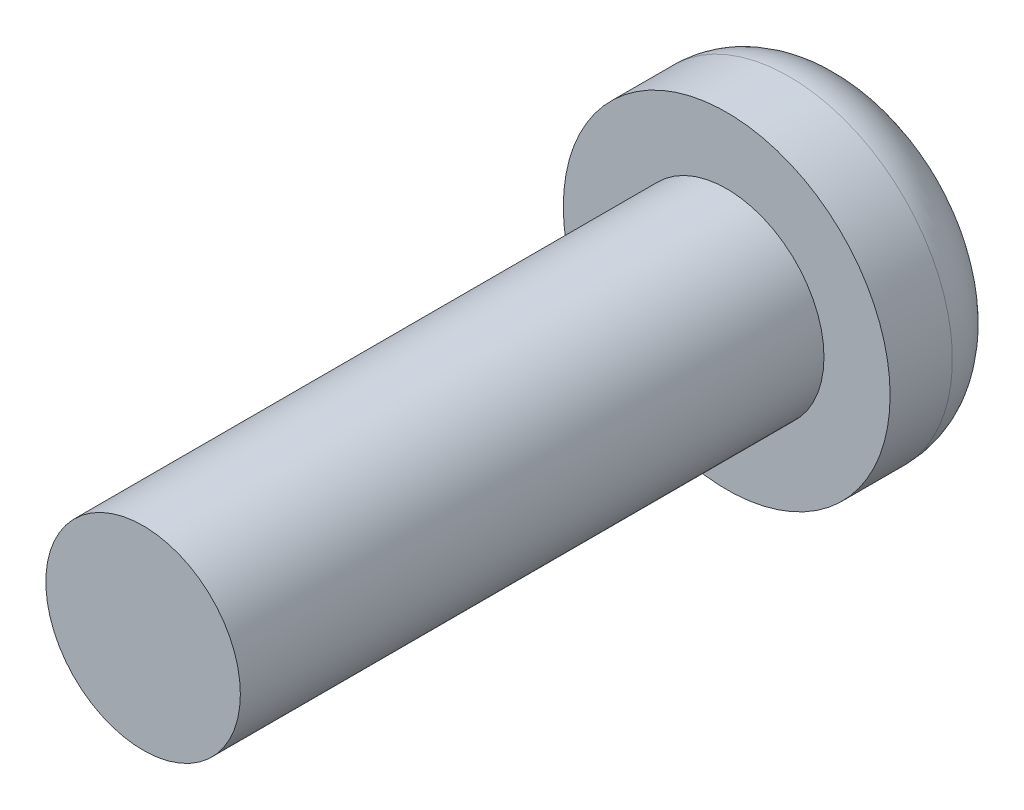
ISO-10303-21;
HEADER;
FILE_DESCRIPTION(('STEP AP214'),'2;1');
FILE_NAME('part.step','',(''),(''),'','','');
FILE_SCHEMA(('AUTOMOTIVE_DESIGN { 1 0 10303 214 1 1 1 1 }'));
ENDSEC;
DATA;
#1=APPLICATION_CONTEXT('core data for automotive mechanical design processes');
#2=APPLICATION_PROTOCOL_DEFINITION('international standard','automotive_design',2000,#1);
#3=PRODUCT_CONTEXT('',#1,'mechanical');
#4=PRODUCT('Part','Part','',(#3));
#5=PRODUCT_RELATED_PRODUCT_CATEGORY('part','',(#4));
#6=PRODUCT_DEFINITION_FORMATION('','',#4);
#7=PRODUCT_DEFINITION_CONTEXT('part definition',#1,'design');
#8=PRODUCT_DEFINITION('design','',#6,#7);
#9=PRODUCT_DEFINITION_SHAPE('','',#8);
#10=(LENGTH_UNIT() NAMED_UNIT(*) SI_UNIT(.MILLI.,.METRE.));
#11=(NAMED_UNIT(*) PLANE_ANGLE_UNIT() SI_UNIT($,.RADIAN.));
#12=(NAMED_UNIT(*) SI_UNIT($,.STERADIAN.) SOLID_ANGLE_UNIT());
#13=UNCERTAINTY_MEASURE_WITH_UNIT(LENGTH_MEASURE(1.E-05),#10,'distance_accuracy_value','');
#14=(GEOMETRIC_REPRESENTATION_CONTEXT(3) GLOBAL_UNCERTAINTY_ASSIGNED_CONTEXT((#13)) GLOBAL_UNIT_ASSIGNED_CONTEXT((#10,
#11,#12)) REPRESENTATION_CONTEXT('',''));
#15=CARTESIAN_POINT('',(0.,0.,0.));
#16=DIRECTION('',(0.,0.,1.));
#17=DIRECTION('',(1.,0.,0.));
#18=AXIS2_PLACEMENT_3D('',#15,#16,#17);
#19=CARTESIAN_POINT('',(0.,0.,0.));
#20=DIRECTION('',(0.,0.,1.));
#21=DIRECTION('',(1.,0.,0.));
#22=AXIS2_PLACEMENT_3D('',#19,#20,#21);
#23=PLANE('',#22);
#24=CARTESIAN_POINT('',(0.,0.,0.));
#25=DIRECTION('',(0.,0.,-1.));
#26=DIRECTION('',(-1.,0.,0.));
#27=AXIS2_PLACEMENT_3D('',#24,#25,#26);
#28=CIRCLE('',#27,1.3);
#29=CARTESIAN_POINT('',(-1.3,0.,0.));
#30=VERTEX_POINT('',#29);
#31=EDGE_CURVE('E244',#30,#30,#28,.T.);
#32=ORIENTED_EDGE('',*,*,#31,.T.);
#33=EDGE_LOOP('',(#32));
#34=FACE_BOUND('',#33,.T.);
#35=DIRECTION('',(0.,-1.,0.));
#36=VECTOR('',#35,1.);
#37=CARTESIAN_POINT('',(-0.25,0.,0.));
#38=LINE('',#37,#36);
#39=CARTESIAN_POINT('',(-0.25,-0.25,0.));
#40=VERTEX_POINT('',#39);
#41=CARTESIAN_POINT('',(-0.25,-1.,0.));
#42=VERTEX_POINT('',#41);
#43=EDGE_CURVE('E56',#40,#42,#38,.T.);
#44=ORIENTED_EDGE('',*,*,#43,.T.);
#45=DIRECTION('',(-1.,0.,0.));
#46=VECTOR('',#45,1.);
#47=CARTESIAN_POINT('',(0.,-1.,0.));
#48=LINE('',#47,#46);
#49=CARTESIAN_POINT('',(0.25,-1.,0.));
#50=VERTEX_POINT('',#49);
#51=EDGE_CURVE('E209',#50,#42,#48,.T.);
#52=ORIENTED_EDGE('',*,*,#51,.F.);
#53=DIRECTION('',(0.,-1.,0.));
#54=VECTOR('',#53,1.);
#55=CARTESIAN_POINT('',(0.25,0.,0.));
#56=LINE('',#55,#54);
#57=CARTESIAN_POINT('',(0.25,-0.25,0.));
#58=VERTEX_POINT('',#57);
#59=EDGE_CURVE('E206',#58,#50,#56,.T.);
#60=ORIENTED_EDGE('',*,*,#59,.F.);
#61=DIRECTION('',(-1.,0.,0.));
#62=VECTOR('',#61,1.);
#63=CARTESIAN_POINT('',(0.,-0.25,0.));
#64=LINE('',#63,#62);
#65=CARTESIAN_POINT('',(1.,-0.25,0.));
#66=VERTEX_POINT('',#65);
#67=EDGE_CURVE('E139',#66,#58,#64,.T.);
#68=ORIENTED_EDGE('',*,*,#67,.F.);
#69=DIRECTION('',(0.,-1.,0.));
#70=VECTOR('',#69,1.);
#71=CARTESIAN_POINT('',(1.,0.,0.));
#72=LINE('',#71,#70);
#73=CARTESIAN_POINT('',(1.,0.25,0.));
#74=VERTEX_POINT('',#73);
#75=EDGE_CURVE('E200',#74,#66,#72,.T.);
#76=ORIENTED_EDGE('',*,*,#75,.F.);
#77=DIRECTION('',(-1.,0.,0.));
#78=VECTOR('',#77,1.);
#79=CARTESIAN_POINT('',(0.,0.25,0.));
#80=LINE('',#79,#78);
#81=CARTESIAN_POINT('',(0.25,0.25,0.));
#82=VERTEX_POINT('',#81);
#83=EDGE_CURVE('E196',#74,#82,#80,.T.);
#84=ORIENTED_EDGE('',*,*,#83,.T.);
#85=DIRECTION('',(0.,-1.,0.));
#86=VECTOR('',#85,1.);
#87=CARTESIAN_POINT('',(0.25,0.,0.));
#88=LINE('',#87,#86);
#89=CARTESIAN_POINT('',(0.25,1.,0.));
#90=VERTEX_POINT('',#89);
#91=EDGE_CURVE('E192',#90,#82,#88,.T.);
#92=ORIENTED_EDGE('',*,*,#91,.F.);
#93=DIRECTION('',(-1.,0.,0.));
#94=VECTOR('',#93,1.);
#95=CARTESIAN_POINT('',(0.,1.,0.));
#96=LINE('',#95,#94);
#97=CARTESIAN_POINT('',(-0.25,1.,0.));
#98=VERTEX_POINT('',#97);
#99=EDGE_CURVE('E188',#90,#98,#96,.T.);
#100=ORIENTED_EDGE('',*,*,#99,.T.);
#101=DIRECTION('',(0.,-1.,0.));
#102=VECTOR('',#101,1.);
#103=CARTESIAN_POINT('',(-0.25,0.,0.));
#104=LINE('',#103,#102);
#105=CARTESIAN_POINT('',(-0.25,0.25,0.));
#106=VERTEX_POINT('',#105);
#107=EDGE_CURVE('E184',#98,#106,#104,.T.);
#108=ORIENTED_EDGE('',*,*,#107,.T.);
#109=DIRECTION('',(-1.,0.,0.));
#110=VECTOR('',#109,1.);
#111=CARTESIAN_POINT('',(0.,0.25,0.));
#112=LINE('',#111,#110);
#113=CARTESIAN_POINT('',(-1.,0.25,0.));
#114=VERTEX_POINT('',#113);
#115=EDGE_CURVE('E180',#106,#114,#112,.T.);
#116=ORIENTED_EDGE('',*,*,#115,.T.);
#117=DIRECTION('',(0.,-1.,0.));
#118=VECTOR('',#117,1.);
#119=CARTESIAN_POINT('',(-1.,0.,0.));
#120=LINE('',#119,#118);
#121=CARTESIAN_POINT('',(-1.,-0.25,0.));
#122=VERTEX_POINT('',#121);
#123=EDGE_CURVE('E176',#114,#122,#120,.T.);
#124=ORIENTED_EDGE('',*,*,#123,.T.);
#125=DIRECTION('',(-1.,0.,0.));
#126=VECTOR('',#125,1.);
#127=CARTESIAN_POINT('',(0.,-0.25,0.));
#128=LINE('',#127,#126);
#129=EDGE_CURVE('E171',#40,#122,#128,.T.);
#130=ORIENTED_EDGE('',*,*,#129,.F.);
#131=EDGE_LOOP('',(#44,#52,#60,#68,#76,#84,#92,#100,#108,#116,#124,#130));
#132=FACE_BOUND('',#131,.T.);
#133=ADVANCED_FACE('F39',(#34,#132),#23,.F.);
#134=CARTESIAN_POINT('',(0.,0.,1.6));
#135=DIRECTION('',(0.,0.,-1.));
#136=DIRECTION('',(-1.,0.,0.));
#137=AXIS2_PLACEMENT_3D('',#134,#135,#136);
#138=CYLINDRICAL_SURFACE('',#137,2.1);
#139=CARTESIAN_POINT('',(0.,0.,1.6));
#140=DIRECTION('',(0.,0.,1.));
#141=DIRECTION('',(1.,0.,0.));
#142=AXIS2_PLACEMENT_3D('',#139,#140,#141);
#143=CIRCLE('',#142,2.1);
#144=CARTESIAN_POINT('',(2.1,0.,1.6));
#145=VERTEX_POINT('',#144);
#146=EDGE_CURVE('E43',#145,#145,#143,.T.);
#147=ORIENTED_EDGE('',*,*,#146,.F.);
#148=EDGE_LOOP('',(#147));
#149=FACE_BOUND('',#148,.T.);
#150=CARTESIAN_POINT('',(0.,0.,0.8));
#151=DIRECTION('',(0.,0.,-1.));
#152=DIRECTION('',(-1.,0.,0.));
#153=AXIS2_PLACEMENT_3D('',#150,#151,#152);
#154=CIRCLE('',#153,2.1);
#155=CARTESIAN_POINT('',(-2.1,0.,0.8));
#156=VERTEX_POINT('',#155);
#157=EDGE_CURVE('E214',#156,#156,#154,.T.);
#158=ORIENTED_EDGE('',*,*,#157,.F.);
#159=EDGE_LOOP('',(#158));
#160=FACE_BOUND('',#159,.T.);
#161=ADVANCED_FACE('F41',(#149,#160),#138,.T.);
#162=CARTESIAN_POINT('',(0.,0.,1.6));
#163=DIRECTION('',(0.,0.,1.));
#164=DIRECTION('',(1.,0.,0.));
#165=AXIS2_PLACEMENT_3D('',#162,#163,#164);
#166=PLANE('',#165);
#167=CARTESIAN_POINT('',(0.,0.,1.6));
#168=DIRECTION('',(0.,0.,1.));
#169=DIRECTION('',(1.,0.,0.));
#170=AXIS2_PLACEMENT_3D('',#167,#168,#169);
#171=CIRCLE('',#170,1.25);
#172=CARTESIAN_POINT('',(1.25,0.,1.6));
#173=VERTEX_POINT('',#172);
#174=EDGE_CURVE('E11',#173,#173,#171,.T.);
#175=ORIENTED_EDGE('',*,*,#174,.F.);
#176=EDGE_LOOP('',(#175));
#177=FACE_BOUND('',#176,.T.);
#178=ORIENTED_EDGE('',*,*,#146,.T.);
#179=EDGE_LOOP('',(#178));
#180=FACE_BOUND('',#179,.T.);
#181=ADVANCED_FACE('F253',(#177,#180),#166,.T.);
#182=CARTESIAN_POINT('',(0.,0.,0.8));
#183=DIRECTION('',(0.,0.,-1.));
#184=DIRECTION('',(-1.,0.,0.));
#185=AXIS2_PLACEMENT_3D('',#182,#183,#184);
#186=TOROIDAL_SURFACE('',#185,1.3,0.8);
#187=ORIENTED_EDGE('',*,*,#31,.F.);
#188=EDGE_LOOP('',(#187));
#189=FACE_BOUND('',#188,.T.);
#190=ORIENTED_EDGE('',*,*,#157,.T.);
#191=EDGE_LOOP('',(#190));
#192=FACE_BOUND('',#191,.T.);
#193=ADVANCED_FACE('F259',(#189,#192),#186,.T.);
#194=CARTESIAN_POINT('',(-0.25,0.,0.5));
#195=DIRECTION('',(1.,0.,0.));
#196=DIRECTION('',(0.,1.,0.));
#197=AXIS2_PLACEMENT_3D('',#194,#195,#196);
#198=PLANE('',#197);
#199=ORIENTED_EDGE('',*,*,#43,.F.);
#200=DIRECTION('',(0.,0.,-1.));
#201=VECTOR('',#200,1.);
#202=CARTESIAN_POINT('',(-0.25,-0.25,0.5));
#203=LINE('',#202,#201);
#204=CARTESIAN_POINT('',(-0.25,-0.25,0.5));
#205=VERTEX_POINT('',#204);
#206=EDGE_CURVE('E104',#205,#40,#203,.T.);
#207=ORIENTED_EDGE('',*,*,#206,.F.);
#208=DIRECTION('',(0.,-1.,0.));
#209=VECTOR('',#208,1.);
#210=CARTESIAN_POINT('',(-0.25,0.,0.5));
#211=LINE('',#210,#209);
#212=CARTESIAN_POINT('',(-0.25,-1.,0.5));
#213=VERTEX_POINT('',#212);
#214=EDGE_CURVE('E62',#205,#213,#211,.T.);
#215=ORIENTED_EDGE('',*,*,#214,.T.);
#216=DIRECTION('',(0.,0.,-1.));
#217=VECTOR('',#216,1.);
#218=CARTESIAN_POINT('',(-0.25,-1.,0.5));
#219=LINE('',#218,#217);
#220=EDGE_CURVE('E100',#213,#42,#219,.T.);
#221=ORIENTED_EDGE('',*,*,#220,.T.);
#222=EDGE_LOOP('',(#199,#207,#215,#221));
#223=FACE_BOUND('',#222,.T.);
#224=ADVANCED_FACE('F261',(#223),#198,.T.);
#225=CARTESIAN_POINT('',(0.,-1.,0.5));
#226=DIRECTION('',(0.,-1.,0.));
#227=DIRECTION('',(0.,0.,-1.));
#228=AXIS2_PLACEMENT_3D('',#225,#226,#227);
#229=PLANE('',#228);
#230=ORIENTED_EDGE('',*,*,#51,.T.);
#231=ORIENTED_EDGE('',*,*,#220,.F.);
#232=DIRECTION('',(-1.,0.,0.));
#233=VECTOR('',#232,1.);
#234=CARTESIAN_POINT('',(0.,-1.,0.5));
#235=LINE('',#234,#233);
#236=CARTESIAN_POINT('',(0.25,-1.,0.5));
#237=VERTEX_POINT('',#236);
#238=EDGE_CURVE('E154',#237,#213,#235,.T.);
#239=ORIENTED_EDGE('',*,*,#238,.F.);
#240=DIRECTION('',(0.,0.,-1.));
#241=VECTOR('',#240,1.);
#242=CARTESIAN_POINT('',(0.25,-1.,0.5));
#243=LINE('',#242,#241);
#244=EDGE_CURVE('E144',#237,#50,#243,.T.);
#245=ORIENTED_EDGE('',*,*,#244,.T.);
#246=EDGE_LOOP('',(#230,#231,#239,#245));
#247=FACE_BOUND('',#246,.T.);
#248=ADVANCED_FACE('F268',(#247),#229,.F.);
#249=CARTESIAN_POINT('',(0.25,0.,0.5));
#250=DIRECTION('',(1.,0.,0.));
#251=DIRECTION('',(0.,1.,0.));
#252=AXIS2_PLACEMENT_3D('',#249,#250,#251);
#253=PLANE('',#252);
#254=ORIENTED_EDGE('',*,*,#59,.T.);
#255=ORIENTED_EDGE('',*,*,#244,.F.);
#256=DIRECTION('',(0.,-1.,0.));
#257=VECTOR('',#256,1.);
#258=CARTESIAN_POINT('',(0.25,0.,0.5));
#259=LINE('',#258,#257);
#260=CARTESIAN_POINT('',(0.25,-0.25,0.5));
#261=VERTEX_POINT('',#260);
#262=EDGE_CURVE('E148',#261,#237,#259,.T.);
#263=ORIENTED_EDGE('',*,*,#262,.F.);
#264=DIRECTION('',(0.,0.,-1.));
#265=VECTOR('',#264,1.);
#266=CARTESIAN_POINT('',(0.25,-0.25,0.5));
#267=LINE('',#266,#265);
#268=EDGE_CURVE('E132',#261,#58,#267,.T.);
#269=ORIENTED_EDGE('',*,*,#268,.T.);
#270=EDGE_LOOP('',(#254,#255,#263,#269));
#271=FACE_BOUND('',#270,.T.);
#272=ADVANCED_FACE('F149',(#271),#253,.F.);
#273=CARTESIAN_POINT('',(0.,-0.25,0.5));
#274=DIRECTION('',(0.,-1.,0.));
#275=DIRECTION('',(0.,0.,-1.));
#276=AXIS2_PLACEMENT_3D('',#273,#274,#275);
#277=PLANE('',#276);
#278=ORIENTED_EDGE('',*,*,#67,.T.);
#279=ORIENTED_EDGE('',*,*,#268,.F.);
#280=DIRECTION('',(-1.,0.,0.));
#281=VECTOR('',#280,1.);
#282=CARTESIAN_POINT('',(0.,-0.25,0.5));
#283=LINE('',#282,#281);
#284=CARTESIAN_POINT('',(1.,-0.25,0.5));
#285=VERTEX_POINT('',#284);
#286=EDGE_CURVE('E136',#285,#261,#283,.T.);
#287=ORIENTED_EDGE('',*,*,#286,.F.);
#288=DIRECTION('',(0.,0.,-1.));
#289=VECTOR('',#288,1.);
#290=CARTESIAN_POINT('',(1.,-0.25,0.5));
#291=LINE('',#290,#289);
#292=EDGE_CURVE('E145',#285,#66,#291,.T.);
#293=ORIENTED_EDGE('',*,*,#292,.T.);
#294=EDGE_LOOP('',(#278,#279,#287,#293));
#295=FACE_BOUND('',#294,.T.);
#296=ADVANCED_FACE('F134',(#295),#277,.F.);
#297=CARTESIAN_POINT('',(1.,0.,0.5));
#298=DIRECTION('',(1.,0.,0.));
#299=DIRECTION('',(0.,0.,-1.));
#300=AXIS2_PLACEMENT_3D('',#297,#298,#299);
#301=PLANE('',#300);
#302=ORIENTED_EDGE('',*,*,#75,.T.);
#303=ORIENTED_EDGE('',*,*,#292,.F.);
#304=DIRECTION('',(0.,-1.,0.));
#305=VECTOR('',#304,1.);
#306=CARTESIAN_POINT('',(1.,0.,0.5));
#307=LINE('',#306,#305);
#308=CARTESIAN_POINT('',(1.,0.25,0.5));
#309=VERTEX_POINT('',#308);
#310=EDGE_CURVE('E159',#309,#285,#307,.T.);
#311=ORIENTED_EDGE('',*,*,#310,.F.);
#312=DIRECTION('',(0.,0.,-1.));
#313=VECTOR('',#312,1.);
#314=CARTESIAN_POINT('',(1.,0.25,0.5));
#315=LINE('',#314,#313);
#316=EDGE_CURVE('E219',#309,#74,#315,.T.);
#317=ORIENTED_EDGE('',*,*,#316,.T.);
#318=EDGE_LOOP('',(#302,#303,#311,#317));
#319=FACE_BOUND('',#318,.T.);
#320=ADVANCED_FACE('F329',(#319),#301,.F.);
#321=CARTESIAN_POINT('',(0.,0.25,0.5));
#322=DIRECTION('',(0.,-1.,0.));
#323=DIRECTION('',(0.,0.,-1.));
#324=AXIS2_PLACEMENT_3D('',#321,#322,#323);
#325=PLANE('',#324);
#326=ORIENTED_EDGE('',*,*,#83,.F.);
#327=ORIENTED_EDGE('',*,*,#316,.F.);
#328=DIRECTION('',(-1.,0.,0.));
#329=VECTOR('',#328,1.);
#330=CARTESIAN_POINT('',(0.,0.25,0.5));
#331=LINE('',#330,#329);
#332=CARTESIAN_POINT('',(0.25,0.25,0.5));
#333=VERTEX_POINT('',#332);
#334=EDGE_CURVE('E163',#309,#333,#331,.T.);
#335=ORIENTED_EDGE('',*,*,#334,.T.);
#336=DIRECTION('',(0.,0.,-1.));
#337=VECTOR('',#336,1.);
#338=CARTESIAN_POINT('',(0.25,0.25,0.5));
#339=LINE('',#338,#337);
#340=EDGE_CURVE('E222',#333,#82,#339,.T.);
#341=ORIENTED_EDGE('',*,*,#340,.T.);
#342=EDGE_LOOP('',(#326,#327,#335,#341));
#343=FACE_BOUND('',#342,.T.);
#344=ADVANCED_FACE('F310',(#343),#325,.T.);
#345=CARTESIAN_POINT('',(0.25,0.,0.5));
#346=DIRECTION('',(1.,0.,0.));
#347=DIRECTION('',(0.,1.,0.));
#348=AXIS2_PLACEMENT_3D('',#345,#346,#347);
#349=PLANE('',#348);
#350=ORIENTED_EDGE('',*,*,#91,.T.);
#351=ORIENTED_EDGE('',*,*,#340,.F.);
#352=DIRECTION('',(0.,-1.,0.));
#353=VECTOR('',#352,1.);
#354=CARTESIAN_POINT('',(0.25,0.,0.5));
#355=LINE('',#354,#353);
#356=CARTESIAN_POINT('',(0.25,1.,0.5));
#357=VERTEX_POINT('',#356);
#358=EDGE_CURVE('E303',#357,#333,#355,.T.);
#359=ORIENTED_EDGE('',*,*,#358,.F.);
#360=DIRECTION('',(0.,0.,-1.));
#361=VECTOR('',#360,1.);
#362=CARTESIAN_POINT('',(0.25,1.,0.5));
#363=LINE('',#362,#361);
#364=EDGE_CURVE('E225',#357,#90,#363,.T.);
#365=ORIENTED_EDGE('',*,*,#364,.T.);
#366=EDGE_LOOP('',(#350,#351,#359,#365));
#367=FACE_BOUND('',#366,.T.);
#368=ADVANCED_FACE('F313',(#367),#349,.F.);
#369=CARTESIAN_POINT('',(0.,1.,0.5));
#370=DIRECTION('',(0.,-1.,0.));
#371=DIRECTION('',(0.,0.,-1.));
#372=AXIS2_PLACEMENT_3D('',#369,#370,#371);
#373=PLANE('',#372);
#374=ORIENTED_EDGE('',*,*,#99,.F.);
#375=ORIENTED_EDGE('',*,*,#364,.F.);
#376=DIRECTION('',(-1.,0.,0.));
#377=VECTOR('',#376,1.);
#378=CARTESIAN_POINT('',(0.,1.,0.5));
#379=LINE('',#378,#377);
#380=CARTESIAN_POINT('',(-0.25,1.,0.5));
#381=VERTEX_POINT('',#380);
#382=EDGE_CURVE('E300',#357,#381,#379,.T.);
#383=ORIENTED_EDGE('',*,*,#382,.T.);
#384=DIRECTION('',(0.,0.,-1.));
#385=VECTOR('',#384,1.);
#386=CARTESIAN_POINT('',(-0.25,1.,0.5));
#387=LINE('',#386,#385);
#388=EDGE_CURVE('E228',#381,#98,#387,.T.);
#389=ORIENTED_EDGE('',*,*,#388,.T.);
#390=EDGE_LOOP('',(#374,#375,#383,#389));
#391=FACE_BOUND('',#390,.T.);
#392=ADVANCED_FACE('F321',(#391),#373,.T.);
#393=CARTESIAN_POINT('',(-0.25,0.,0.5));
#394=DIRECTION('',(1.,0.,0.));
#395=DIRECTION('',(0.,1.,0.));
#396=AXIS2_PLACEMENT_3D('',#393,#394,#395);
#397=PLANE('',#396);
#398=ORIENTED_EDGE('',*,*,#107,.F.);
#399=ORIENTED_EDGE('',*,*,#388,.F.);
#400=DIRECTION('',(0.,-1.,0.));
#401=VECTOR('',#400,1.);
#402=CARTESIAN_POINT('',(-0.25,0.,0.5));
#403=LINE('',#402,#401);
#404=CARTESIAN_POINT('',(-0.25,0.25,0.5));
#405=VERTEX_POINT('',#404);
#406=EDGE_CURVE('E297',#381,#405,#403,.T.);
#407=ORIENTED_EDGE('',*,*,#406,.T.);
#408=DIRECTION('',(0.,0.,-1.));
#409=VECTOR('',#408,1.);
#410=CARTESIAN_POINT('',(-0.25,0.25,0.5));
#411=LINE('',#410,#409);
#412=EDGE_CURVE('E231',#405,#106,#411,.T.);
#413=ORIENTED_EDGE('',*,*,#412,.T.);
#414=EDGE_LOOP('',(#398,#399,#407,#413));
#415=FACE_BOUND('',#414,.T.);
#416=ADVANCED_FACE('F324',(#415),#397,.T.);
#417=CARTESIAN_POINT('',(0.,0.25,0.5));
#418=DIRECTION('',(0.,-1.,0.));
#419=DIRECTION('',(0.,0.,-1.));
#420=AXIS2_PLACEMENT_3D('',#417,#418,#419);
#421=PLANE('',#420);
#422=ORIENTED_EDGE('',*,*,#115,.F.);
#423=ORIENTED_EDGE('',*,*,#412,.F.);
#424=DIRECTION('',(-1.,0.,0.));
#425=VECTOR('',#424,1.);
#426=CARTESIAN_POINT('',(0.,0.25,0.5));
#427=LINE('',#426,#425);
#428=CARTESIAN_POINT('',(-1.,0.25,0.5));
#429=VERTEX_POINT('',#428);
#430=EDGE_CURVE('E291',#405,#429,#427,.T.);
#431=ORIENTED_EDGE('',*,*,#430,.T.);
#432=DIRECTION('',(0.,0.,-1.));
#433=VECTOR('',#432,1.);
#434=CARTESIAN_POINT('',(-1.,0.25,0.5));
#435=LINE('',#434,#433);
#436=EDGE_CURVE('E234',#429,#114,#435,.T.);
#437=ORIENTED_EDGE('',*,*,#436,.T.);
#438=EDGE_LOOP('',(#422,#423,#431,#437));
#439=FACE_BOUND('',#438,.T.);
#440=ADVANCED_FACE('F346',(#439),#421,.T.);
#441=CARTESIAN_POINT('',(-1.,0.,0.5));
#442=DIRECTION('',(1.,0.,0.));
#443=DIRECTION('',(0.,0.,-1.));
#444=AXIS2_PLACEMENT_3D('',#441,#442,#443);
#445=PLANE('',#444);
#446=ORIENTED_EDGE('',*,*,#123,.F.);
#447=ORIENTED_EDGE('',*,*,#436,.F.);
#448=DIRECTION('',(0.,-1.,0.));
#449=VECTOR('',#448,1.);
#450=CARTESIAN_POINT('',(-1.,0.,0.5));
#451=LINE('',#450,#449);
#452=CARTESIAN_POINT('',(-1.,-0.25,0.5));
#453=VERTEX_POINT('',#452);
#454=EDGE_CURVE('E287',#429,#453,#451,.T.);
#455=ORIENTED_EDGE('',*,*,#454,.T.);
#456=DIRECTION('',(0.,0.,-1.));
#457=VECTOR('',#456,1.);
#458=CARTESIAN_POINT('',(-1.,-0.25,0.5));
#459=LINE('',#458,#457);
#460=EDGE_CURVE('E237',#453,#122,#459,.T.);
#461=ORIENTED_EDGE('',*,*,#460,.T.);
#462=EDGE_LOOP('',(#446,#447,#455,#461));
#463=FACE_BOUND('',#462,.T.);
#464=ADVANCED_FACE('F349',(#463),#445,.T.);
#465=CARTESIAN_POINT('',(0.,-0.25,0.5));
#466=DIRECTION('',(0.,-1.,0.));
#467=DIRECTION('',(0.,0.,-1.));
#468=AXIS2_PLACEMENT_3D('',#465,#466,#467);
#469=PLANE('',#468);
#470=ORIENTED_EDGE('',*,*,#129,.T.);
#471=ORIENTED_EDGE('',*,*,#460,.F.);
#472=DIRECTION('',(-1.,0.,0.));
#473=VECTOR('',#472,1.);
#474=CARTESIAN_POINT('',(0.,-0.25,0.5));
#475=LINE('',#474,#473);
#476=EDGE_CURVE('E284',#205,#453,#475,.T.);
#477=ORIENTED_EDGE('',*,*,#476,.F.);
#478=ORIENTED_EDGE('',*,*,#206,.T.);
#479=EDGE_LOOP('',(#470,#471,#477,#478));
#480=FACE_BOUND('',#479,.T.);
#481=ADVANCED_FACE('F281',(#480),#469,.F.);
#482=CARTESIAN_POINT('',(0.,0.,0.5));
#483=DIRECTION('',(0.,0.,-1.));
#484=DIRECTION('',(-1.,0.,0.));
#485=AXIS2_PLACEMENT_3D('',#482,#483,#484);
#486=PLANE('',#485);
#487=ORIENTED_EDGE('',*,*,#214,.F.);
#488=ORIENTED_EDGE('',*,*,#476,.T.);
#489=ORIENTED_EDGE('',*,*,#454,.F.);
#490=ORIENTED_EDGE('',*,*,#430,.F.);
#491=ORIENTED_EDGE('',*,*,#406,.F.);
#492=ORIENTED_EDGE('',*,*,#382,.F.);
#493=ORIENTED_EDGE('',*,*,#358,.T.);
#494=ORIENTED_EDGE('',*,*,#334,.F.);
#495=ORIENTED_EDGE('',*,*,#310,.T.);
#496=ORIENTED_EDGE('',*,*,#286,.T.);
#497=ORIENTED_EDGE('',*,*,#262,.T.);
#498=ORIENTED_EDGE('',*,*,#238,.T.);
#499=EDGE_LOOP('',(#487,#488,#489,#490,#491,#492,#493,#494,#495,#496,#497,#498));
#500=FACE_BOUND('',#499,.T.);
#501=ADVANCED_FACE('F156',(#500),#486,.T.);
#502=CARTESIAN_POINT('',(0.,0.,9.1));
#503=DIRECTION('',(0.,0.,-1.));
#504=DIRECTION('',(-1.,0.,0.));
#505=AXIS2_PLACEMENT_3D('',#502,#503,#504);
#506=CYLINDRICAL_SURFACE('',#505,1.25);
#507=CARTESIAN_POINT('',(0.,0.,9.1));
#508=DIRECTION('',(0.,0.,1.));
#509=DIRECTION('',(1.,0.,0.));
#510=AXIS2_PLACEMENT_3D('',#507,#508,#509);
#511=CIRCLE('',#510,1.25);
#512=CARTESIAN_POINT('',(1.25,0.,9.1));
#513=VERTEX_POINT('',#512);
#514=EDGE_CURVE('E172',#513,#513,#511,.T.);
#515=ORIENTED_EDGE('',*,*,#514,.F.);
#516=EDGE_LOOP('',(#515));
#517=FACE_BOUND('',#516,.T.);
#518=ORIENTED_EDGE('',*,*,#174,.T.);
#519=EDGE_LOOP('',(#518));
#520=FACE_BOUND('',#519,.T.);
#521=ADVANCED_FACE('F358',(#517,#520),#506,.T.);
#522=CARTESIAN_POINT('',(0.,0.,9.1));
#523=DIRECTION('',(0.,0.,1.));
#524=DIRECTION('',(1.,0.,0.));
#525=AXIS2_PLACEMENT_3D('',#522,#523,#524);
#526=PLANE('',#525);
#527=ORIENTED_EDGE('',*,*,#514,.T.);
#528=EDGE_LOOP('',(#527));
#529=FACE_BOUND('',#528,.T.);
#530=ADVANCED_FACE('F363',(#529),#526,.T.);
#531=CLOSED_SHELL('',(#133,#161,#181,#193,#224,#248,#272,#296,#320,#344,#368,#392,#416,#440,
#464,#481,#501,#521,#530));
#532=MANIFOLD_SOLID_BREP('B2',#531);
#533=ADVANCED_BREP_SHAPE_REPRESENTATION('',(#18,#532),#14);
#534=SHAPE_DEFINITION_REPRESENTATION(#9,#533);
ENDSEC;
END-ISO-10303-21;
